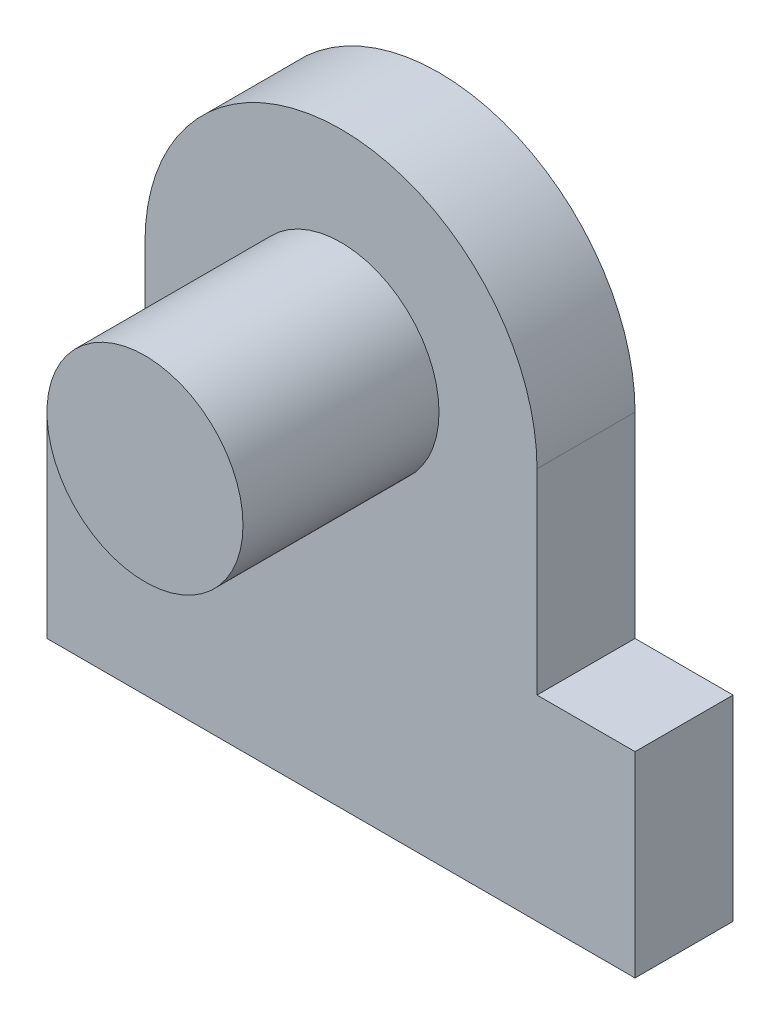
ISO-10303-21;
HEADER;
FILE_DESCRIPTION(('STEP AP214'),'2;1');
FILE_NAME('part.step','',(''),(''),'','','');
FILE_SCHEMA(('AUTOMOTIVE_DESIGN { 1 0 10303 214 1 1 1 1 }'));
ENDSEC;
DATA;
#1=APPLICATION_CONTEXT('core data for automotive mechanical design processes');
#2=APPLICATION_PROTOCOL_DEFINITION('international standard','automotive_design',2000,#1);
#3=PRODUCT_CONTEXT('',#1,'mechanical');
#4=PRODUCT('Part','Part','',(#3));
#5=PRODUCT_RELATED_PRODUCT_CATEGORY('part','',(#4));
#6=PRODUCT_DEFINITION_FORMATION('','',#4);
#7=PRODUCT_DEFINITION_CONTEXT('part definition',#1,'design');
#8=PRODUCT_DEFINITION('design','',#6,#7);
#9=PRODUCT_DEFINITION_SHAPE('','',#8);
#10=(LENGTH_UNIT() NAMED_UNIT(*) SI_UNIT(.MILLI.,.METRE.));
#11=(NAMED_UNIT(*) PLANE_ANGLE_UNIT() SI_UNIT($,.RADIAN.));
#12=(NAMED_UNIT(*) SI_UNIT($,.STERADIAN.) SOLID_ANGLE_UNIT());
#13=UNCERTAINTY_MEASURE_WITH_UNIT(LENGTH_MEASURE(1.E-05),#10,'distance_accuracy_value','');
#14=(GEOMETRIC_REPRESENTATION_CONTEXT(3) GLOBAL_UNCERTAINTY_ASSIGNED_CONTEXT((#13)) GLOBAL_UNIT_ASSIGNED_CONTEXT((#10,
#11,#12)) REPRESENTATION_CONTEXT('',''));
#15=CARTESIAN_POINT('',(0.,0.,0.));
#16=DIRECTION('',(0.,0.,1.));
#17=DIRECTION('',(1.,0.,0.));
#18=AXIS2_PLACEMENT_3D('',#15,#16,#17);
#19=CARTESIAN_POINT('',(29.9999999999999,0.,10.0000000000002));
#20=DIRECTION('',(-1.,0.,0.));
#21=DIRECTION('',(0.,0.,1.));
#22=AXIS2_PLACEMENT_3D('',#19,#20,#21);
#23=PLANE('',#22);
#24=DIRECTION('',(0.,1.,0.));
#25=VECTOR('',#24,1.);
#26=CARTESIAN_POINT('',(30.,0.,0.));
#27=LINE('',#26,#25);
#28=CARTESIAN_POINT('',(30.,0.,0.));
#29=VERTEX_POINT('',#28);
#30=CARTESIAN_POINT('',(29.9999999999998,19.9999999999998,1.00613961606655E-13));
#31=VERTEX_POINT('',#30);
#32=EDGE_CURVE('E152',#29,#31,#27,.T.);
#33=ORIENTED_EDGE('',*,*,#32,.T.);
#34=DIRECTION('',(0.,0.,-1.));
#35=VECTOR('',#34,1.);
#36=CARTESIAN_POINT('',(29.9999999999998,20.,10.0000000000002));
#37=LINE('',#36,#35);
#38=CARTESIAN_POINT('',(29.9999999999998,20.,10.0000000000002));
#39=VERTEX_POINT('',#38);
#40=EDGE_CURVE('E11',#39,#31,#37,.T.);
#41=ORIENTED_EDGE('',*,*,#40,.F.);
#42=DIRECTION('',(0.,1.,0.));
#43=VECTOR('',#42,1.);
#44=CARTESIAN_POINT('',(29.9999999999999,0.,10.0000000000002));
#45=LINE('',#44,#43);
#46=CARTESIAN_POINT('',(29.9999999999999,0.,10.0000000000002));
#47=VERTEX_POINT('',#46);
#48=EDGE_CURVE('E175',#47,#39,#45,.T.);
#49=ORIENTED_EDGE('',*,*,#48,.F.);
#50=DIRECTION('',(0.,0.,-1.));
#51=VECTOR('',#50,1.);
#52=CARTESIAN_POINT('',(29.9999999999999,0.,10.0000000000002));
#53=LINE('',#52,#51);
#54=EDGE_CURVE('E148',#47,#29,#53,.T.);
#55=ORIENTED_EDGE('',*,*,#54,.T.);
#56=EDGE_LOOP('',(#33,#41,#49,#55));
#57=FACE_BOUND('',#56,.T.);
#58=ADVANCED_FACE('F49',(#57),#23,.F.);
#59=CARTESIAN_POINT('',(29.9999999999998,20.,10.0000000000002));
#60=DIRECTION('',(0.,-1.,0.));
#61=DIRECTION('',(0.,0.,-1.));
#62=AXIS2_PLACEMENT_3D('',#59,#60,#61);
#63=PLANE('',#62);
#64=DIRECTION('',(-1.,0.,0.));
#65=VECTOR('',#64,1.);
#66=CARTESIAN_POINT('',(29.9999999999998,19.9999999999998,1.00613961606655E-13));
#67=LINE('',#66,#65);
#68=CARTESIAN_POINT('',(19.9999999999999,19.9999999999999,0.));
#69=VERTEX_POINT('',#68);
#70=EDGE_CURVE('E156',#31,#69,#67,.T.);
#71=ORIENTED_EDGE('',*,*,#70,.T.);
#72=DIRECTION('',(0.,0.,-1.));
#73=VECTOR('',#72,1.);
#74=CARTESIAN_POINT('',(19.9999999999998,19.9999999999999,10.0000000000001));
#75=LINE('',#74,#73);
#76=CARTESIAN_POINT('',(19.9999999999998,19.9999999999999,10.0000000000001));
#77=VERTEX_POINT('',#76);
#78=EDGE_CURVE('E58',#77,#69,#75,.T.);
#79=ORIENTED_EDGE('',*,*,#78,.F.);
#80=DIRECTION('',(-1.,0.,0.));
#81=VECTOR('',#80,1.);
#82=CARTESIAN_POINT('',(29.9999999999998,20.,10.0000000000002));
#83=LINE('',#82,#81);
#84=EDGE_CURVE('E109',#39,#77,#83,.T.);
#85=ORIENTED_EDGE('',*,*,#84,.F.);
#86=ORIENTED_EDGE('',*,*,#40,.T.);
#87=EDGE_LOOP('',(#71,#79,#85,#86));
#88=FACE_BOUND('',#87,.T.);
#89=ADVANCED_FACE('F253',(#88),#63,.F.);
#90=CARTESIAN_POINT('',(19.9999999999998,19.9999999999999,10.0000000000001));
#91=DIRECTION('',(-1.,0.,0.));
#92=DIRECTION('',(0.,-1.,0.));
#93=AXIS2_PLACEMENT_3D('',#90,#91,#92);
#94=PLANE('',#93);
#95=DIRECTION('',(0.,1.,0.));
#96=VECTOR('',#95,1.);
#97=CARTESIAN_POINT('',(19.9999999999999,19.9999999999999,0.));
#98=LINE('',#97,#96);
#99=CARTESIAN_POINT('',(19.9999999999997,39.9999999999999,2.1163626406917E-13));
#100=VERTEX_POINT('',#99);
#101=EDGE_CURVE('E160',#69,#100,#98,.T.);
#102=ORIENTED_EDGE('',*,*,#101,.T.);
#103=DIRECTION('',(0.,0.,-1.));
#104=VECTOR('',#103,1.);
#105=CARTESIAN_POINT('',(19.9999999999999,39.9999999999999,10.));
#106=LINE('',#105,#104);
#107=CARTESIAN_POINT('',(19.9999999999999,39.9999999999999,10.));
#108=VERTEX_POINT('',#107);
#109=EDGE_CURVE('E186',#108,#100,#106,.T.);
#110=ORIENTED_EDGE('',*,*,#109,.F.);
#111=DIRECTION('',(0.,1.,0.));
#112=VECTOR('',#111,1.);
#113=CARTESIAN_POINT('',(19.9999999999998,19.9999999999999,10.0000000000001));
#114=LINE('',#113,#112);
#115=EDGE_CURVE('E198',#77,#108,#114,.T.);
#116=ORIENTED_EDGE('',*,*,#115,.F.);
#117=ORIENTED_EDGE('',*,*,#78,.T.);
#118=EDGE_LOOP('',(#102,#110,#116,#117));
#119=FACE_BOUND('',#118,.T.);
#120=ADVANCED_FACE('F196',(#119),#94,.F.);
#121=CARTESIAN_POINT('',(-1.94289029309402E-13,39.9999999999999,10.0000000000001));
#122=DIRECTION('',(0.,0.,-1.));
#123=DIRECTION('',(-1.,0.,0.));
#124=AXIS2_PLACEMENT_3D('',#121,#122,#123);
#125=CYLINDRICAL_SURFACE('',#124,20.);
#126=CARTESIAN_POINT('',(0.,39.9999999999999,0.));
#127=DIRECTION('',(0.,0.,1.));
#128=DIRECTION('',(1.,0.,0.));
#129=AXIS2_PLACEMENT_3D('',#126,#127,#128);
#130=CIRCLE('',#129,20.);
#131=CARTESIAN_POINT('',(-20.,40.,0.));
#132=VERTEX_POINT('',#131);
#133=EDGE_CURVE('E163',#100,#132,#130,.T.);
#134=ORIENTED_EDGE('',*,*,#133,.T.);
#135=DIRECTION('',(0.,0.,-1.));
#136=VECTOR('',#135,1.);
#137=CARTESIAN_POINT('',(-20.0000000000001,40.,10.0000000000001));
#138=LINE('',#137,#136);
#139=CARTESIAN_POINT('',(-20.0000000000001,40.,10.0000000000001));
#140=VERTEX_POINT('',#139);
#141=EDGE_CURVE('E182',#140,#132,#138,.T.);
#142=ORIENTED_EDGE('',*,*,#141,.F.);
#143=CARTESIAN_POINT('',(-1.94289029309402E-13,39.9999999999999,10.0000000000001));
#144=DIRECTION('',(0.,0.,1.));
#145=DIRECTION('',(1.,0.,0.));
#146=AXIS2_PLACEMENT_3D('',#143,#144,#145);
#147=CIRCLE('',#146,20.);
#148=EDGE_CURVE('E211',#108,#140,#147,.T.);
#149=ORIENTED_EDGE('',*,*,#148,.F.);
#150=ORIENTED_EDGE('',*,*,#109,.T.);
#151=EDGE_LOOP('',(#134,#142,#149,#150));
#152=FACE_BOUND('',#151,.T.);
#153=ADVANCED_FACE('F206',(#152),#125,.T.);
#154=CARTESIAN_POINT('',(-20.0000000000001,20.,10.));
#155=DIRECTION('',(1.,0.,0.));
#156=DIRECTION('',(0.,1.,0.));
#157=AXIS2_PLACEMENT_3D('',#154,#155,#156);
#158=PLANE('',#157);
#159=DIRECTION('',(0.,-1.,0.));
#160=VECTOR('',#159,1.);
#161=CARTESIAN_POINT('',(-20.0000000000001,20.,0.));
#162=LINE('',#161,#160);
#163=CARTESIAN_POINT('',(-20.0000000000001,20.,0.));
#164=VERTEX_POINT('',#163);
#165=EDGE_CURVE('E166',#132,#164,#162,.T.);
#166=ORIENTED_EDGE('',*,*,#165,.T.);
#167=DIRECTION('',(0.,0.,-1.));
#168=VECTOR('',#167,1.);
#169=CARTESIAN_POINT('',(-20.0000000000001,20.,10.));
#170=LINE('',#169,#168);
#171=CARTESIAN_POINT('',(-20.0000000000001,20.,10.));
#172=VERTEX_POINT('',#171);
#173=EDGE_CURVE('E139',#172,#164,#170,.T.);
#174=ORIENTED_EDGE('',*,*,#173,.F.);
#175=DIRECTION('',(0.,-1.,0.));
#176=VECTOR('',#175,1.);
#177=CARTESIAN_POINT('',(-20.0000000000001,20.,10.));
#178=LINE('',#177,#176);
#179=EDGE_CURVE('E128',#140,#172,#178,.T.);
#180=ORIENTED_EDGE('',*,*,#179,.F.);
#181=ORIENTED_EDGE('',*,*,#141,.T.);
#182=EDGE_LOOP('',(#166,#174,#180,#181));
#183=FACE_BOUND('',#182,.T.);
#184=ADVANCED_FACE('F209',(#183),#158,.F.);
#185=CARTESIAN_POINT('',(-30.,20.,10.));
#186=DIRECTION('',(0.,-1.,0.));
#187=DIRECTION('',(1.,0.,0.));
#188=AXIS2_PLACEMENT_3D('',#185,#186,#187);
#189=PLANE('',#188);
#190=DIRECTION('',(-1.,0.,0.));
#191=VECTOR('',#190,1.);
#192=CARTESIAN_POINT('',(-30.0000000000001,19.9999999999999,0.));
#193=LINE('',#192,#191);
#194=CARTESIAN_POINT('',(-30.0000000000001,19.9999999999999,0.));
#195=VERTEX_POINT('',#194);
#196=EDGE_CURVE('E137',#164,#195,#193,.T.);
#197=ORIENTED_EDGE('',*,*,#196,.T.);
#198=DIRECTION('',(0.,0.,-1.));
#199=VECTOR('',#198,1.);
#200=CARTESIAN_POINT('',(-30.,20.,10.));
#201=LINE('',#200,#199);
#202=CARTESIAN_POINT('',(-30.,20.,10.));
#203=VERTEX_POINT('',#202);
#204=EDGE_CURVE('E134',#203,#195,#201,.T.);
#205=ORIENTED_EDGE('',*,*,#204,.F.);
#206=DIRECTION('',(-1.,0.,0.));
#207=VECTOR('',#206,1.);
#208=CARTESIAN_POINT('',(-30.,20.,10.));
#209=LINE('',#208,#207);
#210=EDGE_CURVE('E122',#172,#203,#209,.T.);
#211=ORIENTED_EDGE('',*,*,#210,.F.);
#212=ORIENTED_EDGE('',*,*,#173,.T.);
#213=EDGE_LOOP('',(#197,#205,#211,#212));
#214=FACE_BOUND('',#213,.T.);
#215=ADVANCED_FACE('F135',(#214),#189,.F.);
#216=CARTESIAN_POINT('',(-30.0000000000001,0.,10.));
#217=DIRECTION('',(1.,0.,0.));
#218=DIRECTION('',(0.,0.,-1.));
#219=AXIS2_PLACEMENT_3D('',#216,#217,#218);
#220=PLANE('',#219);
#221=DIRECTION('',(0.,-1.,0.));
#222=VECTOR('',#221,1.);
#223=CARTESIAN_POINT('',(-30.,0.,0.));
#224=LINE('',#223,#222);
#225=CARTESIAN_POINT('',(-30.,0.,0.));
#226=VERTEX_POINT('',#225);
#227=EDGE_CURVE('E95',#195,#226,#224,.T.);
#228=ORIENTED_EDGE('',*,*,#227,.T.);
#229=DIRECTION('',(0.,0.,-1.));
#230=VECTOR('',#229,1.);
#231=CARTESIAN_POINT('',(-30.0000000000001,0.,10.));
#232=LINE('',#231,#230);
#233=CARTESIAN_POINT('',(-30.0000000000001,0.,10.));
#234=VERTEX_POINT('',#233);
#235=EDGE_CURVE('E140',#234,#226,#232,.T.);
#236=ORIENTED_EDGE('',*,*,#235,.F.);
#237=DIRECTION('',(0.,-1.,0.));
#238=VECTOR('',#237,1.);
#239=CARTESIAN_POINT('',(-30.0000000000001,0.,10.));
#240=LINE('',#239,#238);
#241=EDGE_CURVE('E126',#203,#234,#240,.T.);
#242=ORIENTED_EDGE('',*,*,#241,.F.);
#243=ORIENTED_EDGE('',*,*,#204,.T.);
#244=EDGE_LOOP('',(#228,#236,#242,#243));
#245=FACE_BOUND('',#244,.T.);
#246=ADVANCED_FACE('F142',(#245),#220,.F.);
#247=CARTESIAN_POINT('',(-30.0000000000001,0.,10.));
#248=DIRECTION('',(0.,1.,0.));
#249=DIRECTION('',(0.,0.,1.));
#250=AXIS2_PLACEMENT_3D('',#247,#248,#249);
#251=PLANE('',#250);
#252=DIRECTION('',(1.,0.,0.));
#253=VECTOR('',#252,1.);
#254=CARTESIAN_POINT('',(-30.,0.,0.));
#255=LINE('',#254,#253);
#256=EDGE_CURVE('E101',#226,#29,#255,.T.);
#257=ORIENTED_EDGE('',*,*,#256,.T.);
#258=ORIENTED_EDGE('',*,*,#54,.F.);
#259=DIRECTION('',(1.,0.,0.));
#260=VECTOR('',#259,1.);
#261=CARTESIAN_POINT('',(-30.0000000000001,0.,10.));
#262=LINE('',#261,#260);
#263=EDGE_CURVE('E66',#234,#47,#262,.T.);
#264=ORIENTED_EDGE('',*,*,#263,.F.);
#265=ORIENTED_EDGE('',*,*,#235,.T.);
#266=EDGE_LOOP('',(#257,#258,#264,#265));
#267=FACE_BOUND('',#266,.T.);
#268=ADVANCED_FACE('F242',(#267),#251,.F.);
#269=CARTESIAN_POINT('',(-1.94289029309402E-13,39.9999999999999,10.0000000000001));
#270=DIRECTION('',(0.,0.,1.));
#271=DIRECTION('',(1.,0.,0.));
#272=AXIS2_PLACEMENT_3D('',#269,#270,#271);
#273=PLANE('',#272);
#274=CARTESIAN_POINT('',(-1.94289029309402E-13,39.9999999999999,10.0000000000001));
#275=DIRECTION('',(0.,0.,1.));
#276=DIRECTION('',(1.,0.,0.));
#277=AXIS2_PLACEMENT_3D('',#274,#275,#276);
#278=CIRCLE('',#277,10.);
#279=CARTESIAN_POINT('',(9.99999999999981,39.9999999999999,10.0000000000001));
#280=VERTEX_POINT('',#279);
#281=EDGE_CURVE('E223',#280,#280,#278,.T.);
#282=ORIENTED_EDGE('',*,*,#281,.F.);
#283=EDGE_LOOP('',(#282));
#284=FACE_BOUND('',#283,.T.);
#285=ORIENTED_EDGE('',*,*,#48,.T.);
#286=ORIENTED_EDGE('',*,*,#84,.T.);
#287=ORIENTED_EDGE('',*,*,#115,.T.);
#288=ORIENTED_EDGE('',*,*,#148,.T.);
#289=ORIENTED_EDGE('',*,*,#179,.T.);
#290=ORIENTED_EDGE('',*,*,#210,.T.);
#291=ORIENTED_EDGE('',*,*,#241,.T.);
#292=ORIENTED_EDGE('',*,*,#263,.T.);
#293=EDGE_LOOP('',(#285,#286,#287,#288,#289,#290,#291,#292));
#294=FACE_BOUND('',#293,.T.);
#295=ADVANCED_FACE('F124',(#284,#294),#273,.T.);
#296=CARTESIAN_POINT('',(0.,39.9999999999999,0.));
#297=DIRECTION('',(0.,0.,1.));
#298=DIRECTION('',(1.,0.,0.));
#299=AXIS2_PLACEMENT_3D('',#296,#297,#298);
#300=PLANE('',#299);
#301=ORIENTED_EDGE('',*,*,#32,.F.);
#302=ORIENTED_EDGE('',*,*,#256,.F.);
#303=ORIENTED_EDGE('',*,*,#227,.F.);
#304=ORIENTED_EDGE('',*,*,#196,.F.);
#305=ORIENTED_EDGE('',*,*,#165,.F.);
#306=ORIENTED_EDGE('',*,*,#133,.F.);
#307=ORIENTED_EDGE('',*,*,#101,.F.);
#308=ORIENTED_EDGE('',*,*,#70,.F.);
#309=EDGE_LOOP('',(#301,#302,#303,#304,#305,#306,#307,#308));
#310=FACE_BOUND('',#309,.T.);
#311=ADVANCED_FACE('F202',(#310),#300,.F.);
#312=CARTESIAN_POINT('',(-2.22044604925031E-13,39.9999999999999,30.0000000000002));
#313=DIRECTION('',(0.,0.,-1.));
#314=DIRECTION('',(-1.,0.,0.));
#315=AXIS2_PLACEMENT_3D('',#312,#313,#314);
#316=CYLINDRICAL_SURFACE('',#315,10.);
#317=CARTESIAN_POINT('',(-2.22044604925031E-13,39.9999999999999,30.0000000000002));
#318=DIRECTION('',(0.,0.,1.));
#319=DIRECTION('',(1.,0.,0.));
#320=AXIS2_PLACEMENT_3D('',#317,#318,#319);
#321=CIRCLE('',#320,10.);
#322=CARTESIAN_POINT('',(9.99999999999978,39.9999999999999,30.0000000000002));
#323=VERTEX_POINT('',#322);
#324=EDGE_CURVE('E157',#323,#323,#321,.T.);
#325=ORIENTED_EDGE('',*,*,#324,.F.);
#326=EDGE_LOOP('',(#325));
#327=FACE_BOUND('',#326,.T.);
#328=ORIENTED_EDGE('',*,*,#281,.T.);
#329=EDGE_LOOP('',(#328));
#330=FACE_BOUND('',#329,.T.);
#331=ADVANCED_FACE('F235',(#327,#330),#316,.T.);
#332=CARTESIAN_POINT('',(-2.22044604925031E-13,39.9999999999999,30.0000000000002));
#333=DIRECTION('',(0.,0.,1.));
#334=DIRECTION('',(1.,0.,0.));
#335=AXIS2_PLACEMENT_3D('',#332,#333,#334);
#336=PLANE('',#335);
#337=ORIENTED_EDGE('',*,*,#324,.T.);
#338=EDGE_LOOP('',(#337));
#339=FACE_BOUND('',#338,.T.);
#340=ADVANCED_FACE('F233',(#339),#336,.T.);
#341=CLOSED_SHELL('',(#58,#89,#120,#153,#184,#215,#246,#268,#295,#311,#331,#340));
#342=MANIFOLD_SOLID_BREP('B2',#341);
#343=ADVANCED_BREP_SHAPE_REPRESENTATION('',(#18,#342),#14);
#344=SHAPE_DEFINITION_REPRESENTATION(#9,#343);
ENDSEC;
END-ISO-10303-21;
